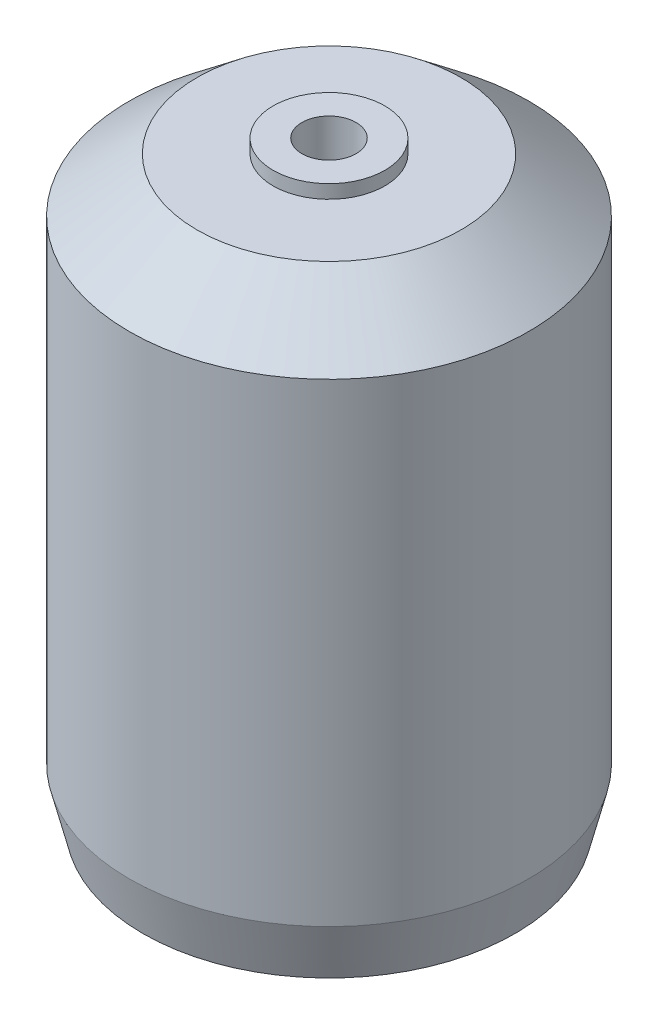
ISO-10303-21;
HEADER;
FILE_DESCRIPTION(('STEP AP214'),'2;1');
FILE_NAME('part.step','',(''),(''),'','','');
FILE_SCHEMA(('AUTOMOTIVE_DESIGN { 1 0 10303 214 1 1 1 1 }'));
ENDSEC;
DATA;
#1=APPLICATION_CONTEXT('core data for automotive mechanical design processes');
#2=APPLICATION_PROTOCOL_DEFINITION('international standard','automotive_design',2000,#1);
#3=PRODUCT_CONTEXT('',#1,'mechanical');
#4=PRODUCT('Part','Part','',(#3));
#5=PRODUCT_RELATED_PRODUCT_CATEGORY('part','',(#4));
#6=PRODUCT_DEFINITION_FORMATION('','',#4);
#7=PRODUCT_DEFINITION_CONTEXT('part definition',#1,'design');
#8=PRODUCT_DEFINITION('design','',#6,#7);
#9=PRODUCT_DEFINITION_SHAPE('','',#8);
#10=(LENGTH_UNIT() NAMED_UNIT(*) SI_UNIT(.MILLI.,.METRE.));
#11=(NAMED_UNIT(*) PLANE_ANGLE_UNIT() SI_UNIT($,.RADIAN.));
#12=(NAMED_UNIT(*) SI_UNIT($,.STERADIAN.) SOLID_ANGLE_UNIT());
#13=UNCERTAINTY_MEASURE_WITH_UNIT(LENGTH_MEASURE(1.E-05),#10,'distance_accuracy_value','');
#14=(GEOMETRIC_REPRESENTATION_CONTEXT(3) GLOBAL_UNCERTAINTY_ASSIGNED_CONTEXT((#13)) GLOBAL_UNIT_ASSIGNED_CONTEXT((#10,
#11,#12)) REPRESENTATION_CONTEXT('',''));
#15=CARTESIAN_POINT('',(0.,0.,0.));
#16=DIRECTION('',(0.,0.,1.));
#17=DIRECTION('',(1.,0.,0.));
#18=AXIS2_PLACEMENT_3D('',#15,#16,#17);
#19=CARTESIAN_POINT('',(0.,86.,0.));
#20=DIRECTION('',(0.,-1.,0.));
#21=DIRECTION('',(0.,0.,-1.));
#22=AXIS2_PLACEMENT_3D('',#19,#20,#21);
#23=CYLINDRICAL_SURFACE('',#22,29.5);
#24=CARTESIAN_POINT('',(0.,8.0000000000001,0.));
#25=DIRECTION('',(0.,1.,0.));
#26=DIRECTION('',(0.,0.,1.));
#27=AXIS2_PLACEMENT_3D('',#24,#25,#26);
#28=CIRCLE('',#27,29.5);
#29=CARTESIAN_POINT('',(0.,8.0000000000001,29.5));
#30=VERTEX_POINT('',#29);
#31=EDGE_CURVE('E38',#30,#30,#28,.T.);
#32=ORIENTED_EDGE('',*,*,#31,.T.);
#33=EDGE_LOOP('',(#32));
#34=FACE_BOUND('',#33,.T.);
#35=CARTESIAN_POINT('',(0.,78.,0.));
#36=DIRECTION('',(0.,1.,0.));
#37=DIRECTION('',(0.,0.,1.));
#38=AXIS2_PLACEMENT_3D('',#35,#36,#37);
#39=CIRCLE('',#38,29.5);
#40=CARTESIAN_POINT('',(0.,78.,29.5));
#41=VERTEX_POINT('',#40);
#42=EDGE_CURVE('E42',#41,#41,#39,.F.);
#43=ORIENTED_EDGE('',*,*,#42,.T.);
#44=EDGE_LOOP('',(#43));
#45=FACE_BOUND('',#44,.T.);
#46=ADVANCED_FACE('F31',(#34,#45),#23,.T.);
#47=CARTESIAN_POINT('',(0.,86.,0.));
#48=DIRECTION('',(0.,1.,0.));
#49=DIRECTION('',(0.,0.,1.));
#50=AXIS2_PLACEMENT_3D('',#47,#48,#49);
#51=PLANE('',#50);
#52=CARTESIAN_POINT('',(0.,86.,0.));
#53=DIRECTION('',(0.,1.,0.));
#54=DIRECTION('',(0.,0.,1.));
#55=AXIS2_PLACEMENT_3D('',#52,#53,#54);
#56=CIRCLE('',#55,8.25);
#57=CARTESIAN_POINT('',(0.,86.,8.25));
#58=VERTEX_POINT('',#57);
#59=EDGE_CURVE('E52',#58,#58,#56,.T.);
#60=ORIENTED_EDGE('',*,*,#59,.F.);
#61=EDGE_LOOP('',(#60));
#62=FACE_BOUND('',#61,.T.);
#63=CARTESIAN_POINT('',(0.,86.,0.));
#64=DIRECTION('',(0.,1.,0.));
#65=DIRECTION('',(0.,0.,1.));
#66=AXIS2_PLACEMENT_3D('',#63,#64,#65);
#67=CIRCLE('',#66,19.5);
#68=CARTESIAN_POINT('',(0.,86.,19.5));
#69=VERTEX_POINT('',#68);
#70=EDGE_CURVE('E46',#69,#69,#67,.T.);
#71=ORIENTED_EDGE('',*,*,#70,.T.);
#72=EDGE_LOOP('',(#71));
#73=FACE_BOUND('',#72,.T.);
#74=ADVANCED_FACE('F76',(#62,#73),#51,.T.);
#75=CARTESIAN_POINT('',(0.,0.,0.));
#76=DIRECTION('',(0.,1.,0.));
#77=DIRECTION('',(0.,0.,1.));
#78=AXIS2_PLACEMENT_3D('',#75,#76,#77);
#79=PLANE('',#78);
#80=CARTESIAN_POINT('',(0.,0.,0.));
#81=DIRECTION('',(0.,-1.,0.));
#82=DIRECTION('',(0.,0.,-1.));
#83=AXIS2_PLACEMENT_3D('',#80,#81,#82);
#84=CIRCLE('',#83,4.);
#85=CARTESIAN_POINT('',(0.,0.,-4.));
#86=VERTEX_POINT('',#85);
#87=EDGE_CURVE('E58',#86,#86,#84,.T.);
#88=ORIENTED_EDGE('',*,*,#87,.F.);
#89=EDGE_LOOP('',(#88));
#90=FACE_BOUND('',#89,.T.);
#91=CARTESIAN_POINT('',(0.,0.,0.));
#92=DIRECTION('',(0.,1.,0.));
#93=DIRECTION('',(0.,0.,1.));
#94=AXIS2_PLACEMENT_3D('',#91,#92,#93);
#95=CIRCLE('',#94,27.5);
#96=CARTESIAN_POINT('',(0.,0.,27.5));
#97=VERTEX_POINT('',#96);
#98=EDGE_CURVE('E10',#97,#97,#95,.F.);
#99=ORIENTED_EDGE('',*,*,#98,.T.);
#100=EDGE_LOOP('',(#99));
#101=FACE_BOUND('',#100,.T.);
#102=ADVANCED_FACE('F73',(#90,#101),#79,.F.);
#103=CARTESIAN_POINT('',(0.,86.,0.));
#104=DIRECTION('',(0.,-1.,0.));
#105=DIRECTION('',(0.,0.,-1.));
#106=AXIS2_PLACEMENT_3D('',#103,#104,#105);
#107=CONICAL_SURFACE('',#106,19.5,0.896055384571344);
#108=ORIENTED_EDGE('',*,*,#42,.F.);
#109=EDGE_LOOP('',(#108));
#110=FACE_BOUND('',#109,.T.);
#111=ORIENTED_EDGE('',*,*,#70,.F.);
#112=EDGE_LOOP('',(#111));
#113=FACE_BOUND('',#112,.T.);
#114=ADVANCED_FACE('F75',(#110,#113),#107,.T.);
#115=CARTESIAN_POINT('',(0.,8.0000000000001,0.));
#116=DIRECTION('',(0.,1.,0.));
#117=DIRECTION('',(0.,0.,1.));
#118=AXIS2_PLACEMENT_3D('',#115,#116,#117);
#119=CONICAL_SURFACE('',#118,29.5,0.244978663126861);
#120=ORIENTED_EDGE('',*,*,#98,.F.);
#121=EDGE_LOOP('',(#120));
#122=FACE_BOUND('',#121,.T.);
#123=ORIENTED_EDGE('',*,*,#31,.F.);
#124=EDGE_LOOP('',(#123));
#125=FACE_BOUND('',#124,.T.);
#126=ADVANCED_FACE('F33',(#122,#125),#119,.T.);
#127=CARTESIAN_POINT('',(0.,88.,0.));
#128=DIRECTION('',(0.,-1.,0.));
#129=DIRECTION('',(0.,0.,-1.));
#130=AXIS2_PLACEMENT_3D('',#127,#128,#129);
#131=CYLINDRICAL_SURFACE('',#130,8.25);
#132=CARTESIAN_POINT('',(0.,88.,0.));
#133=DIRECTION('',(0.,1.,0.));
#134=DIRECTION('',(0.,0.,1.));
#135=AXIS2_PLACEMENT_3D('',#132,#133,#134);
#136=CIRCLE('',#135,8.25);
#137=CARTESIAN_POINT('',(0.,88.,8.25));
#138=VERTEX_POINT('',#137);
#139=EDGE_CURVE('E51',#138,#138,#136,.T.);
#140=ORIENTED_EDGE('',*,*,#139,.F.);
#141=EDGE_LOOP('',(#140));
#142=FACE_BOUND('',#141,.T.);
#143=ORIENTED_EDGE('',*,*,#59,.T.);
#144=EDGE_LOOP('',(#143));
#145=FACE_BOUND('',#144,.T.);
#146=ADVANCED_FACE('F109',(#142,#145),#131,.T.);
#147=CARTESIAN_POINT('',(0.,88.,0.));
#148=DIRECTION('',(0.,1.,0.));
#149=DIRECTION('',(0.,0.,1.));
#150=AXIS2_PLACEMENT_3D('',#147,#148,#149);
#151=PLANE('',#150);
#152=CARTESIAN_POINT('',(0.,88.,0.));
#153=DIRECTION('',(0.,-1.,0.));
#154=DIRECTION('',(0.,0.,-1.));
#155=AXIS2_PLACEMENT_3D('',#152,#153,#154);
#156=CIRCLE('',#155,4.);
#157=CARTESIAN_POINT('',(0.,88.,-4.));
#158=VERTEX_POINT('',#157);
#159=EDGE_CURVE('E55',#158,#158,#156,.T.);
#160=ORIENTED_EDGE('',*,*,#159,.T.);
#161=EDGE_LOOP('',(#160));
#162=FACE_BOUND('',#161,.T.);
#163=ORIENTED_EDGE('',*,*,#139,.T.);
#164=EDGE_LOOP('',(#163));
#165=FACE_BOUND('',#164,.T.);
#166=ADVANCED_FACE('F64',(#162,#165),#151,.T.);
#167=CARTESIAN_POINT('',(0.,88.,0.));
#168=DIRECTION('',(0.,-1.,0.));
#169=DIRECTION('',(0.,0.,-1.));
#170=AXIS2_PLACEMENT_3D('',#167,#168,#169);
#171=CYLINDRICAL_SURFACE('',#170,4.);
#172=ORIENTED_EDGE('',*,*,#159,.F.);
#173=EDGE_LOOP('',(#172));
#174=FACE_BOUND('',#173,.T.);
#175=ORIENTED_EDGE('',*,*,#87,.T.);
#176=EDGE_LOOP('',(#175));
#177=FACE_BOUND('',#176,.T.);
#178=ADVANCED_FACE('F67',(#174,#177),#171,.F.);
#179=CLOSED_SHELL('',(#46,#74,#102,#114,#126,#146,#166,#178));
#180=MANIFOLD_SOLID_BREP('B2',#179);
#181=ADVANCED_BREP_SHAPE_REPRESENTATION('',(#18,#180),#14);
#182=SHAPE_DEFINITION_REPRESENTATION(#9,#181);
ENDSEC;
END-ISO-10303-21;
